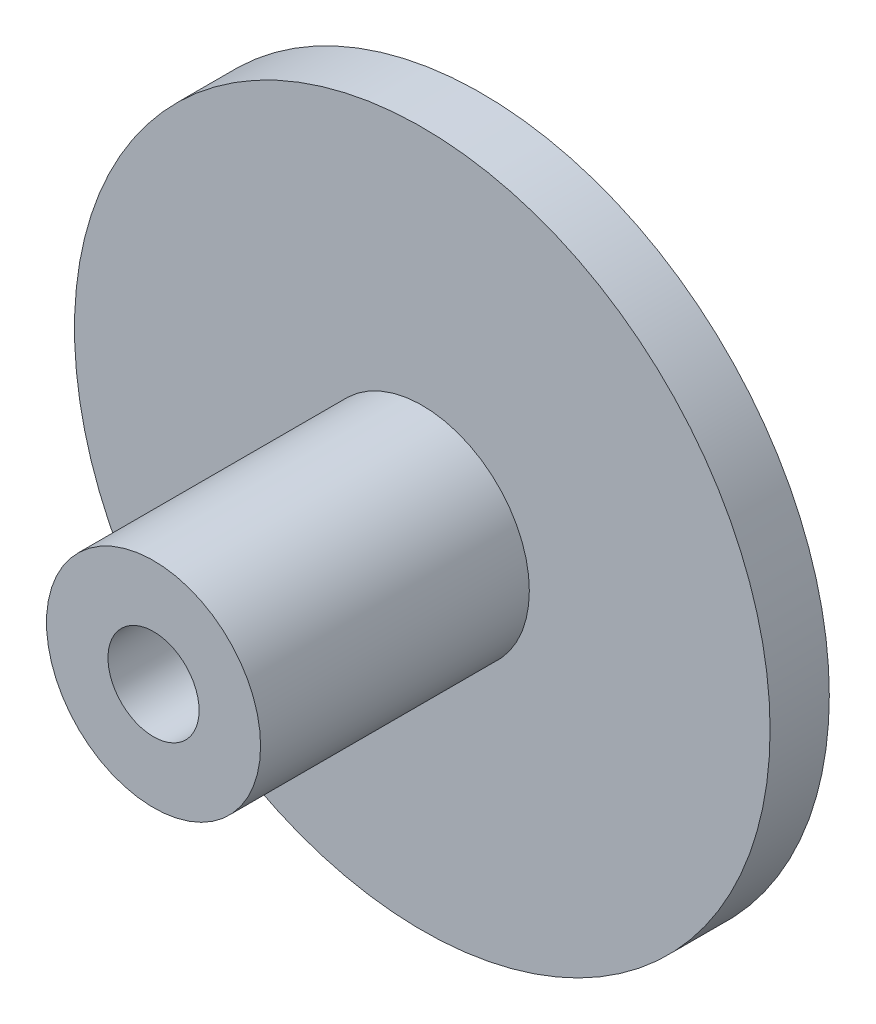
ISO-10303-21;
HEADER;
FILE_DESCRIPTION(('STEP AP214'),'2;1');
FILE_NAME('part.step','',(''),(''),'','','');
FILE_SCHEMA(('AUTOMOTIVE_DESIGN { 1 0 10303 214 1 1 1 1 }'));
ENDSEC;
DATA;
#1=APPLICATION_CONTEXT('core data for automotive mechanical design processes');
#2=APPLICATION_PROTOCOL_DEFINITION('international standard','automotive_design',2000,#1);
#3=PRODUCT_CONTEXT('',#1,'mechanical');
#4=PRODUCT('Part','Part','',(#3));
#5=PRODUCT_RELATED_PRODUCT_CATEGORY('part','',(#4));
#6=PRODUCT_DEFINITION_FORMATION('','',#4);
#7=PRODUCT_DEFINITION_CONTEXT('part definition',#1,'design');
#8=PRODUCT_DEFINITION('design','',#6,#7);
#9=PRODUCT_DEFINITION_SHAPE('','',#8);
#10=(LENGTH_UNIT() NAMED_UNIT(*) SI_UNIT(.MILLI.,.METRE.));
#11=(NAMED_UNIT(*) PLANE_ANGLE_UNIT() SI_UNIT($,.RADIAN.));
#12=(NAMED_UNIT(*) SI_UNIT($,.STERADIAN.) SOLID_ANGLE_UNIT());
#13=UNCERTAINTY_MEASURE_WITH_UNIT(LENGTH_MEASURE(1.E-05),#10,'distance_accuracy_value','');
#14=(GEOMETRIC_REPRESENTATION_CONTEXT(3) GLOBAL_UNCERTAINTY_ASSIGNED_CONTEXT((#13)) GLOBAL_UNIT_ASSIGNED_CONTEXT((#10,
#11,#12)) REPRESENTATION_CONTEXT('',''));
#15=CARTESIAN_POINT('',(0.,0.,0.));
#16=DIRECTION('',(0.,0.,1.));
#17=DIRECTION('',(1.,0.,0.));
#18=AXIS2_PLACEMENT_3D('',#15,#16,#17);
#19=CARTESIAN_POINT('',(0.,0.,1.3));
#20=DIRECTION('',(0.,0.,1.));
#21=DIRECTION('',(1.,0.,0.));
#22=AXIS2_PLACEMENT_3D('',#19,#20,#21);
#23=PLANE('',#22);
#24=CARTESIAN_POINT('',(0.,0.,1.3));
#25=DIRECTION('',(0.,0.,1.));
#26=DIRECTION('',(1.,0.,0.));
#27=AXIS2_PLACEMENT_3D('',#24,#25,#26);
#28=CIRCLE('',#27,7.635);
#29=CARTESIAN_POINT('',(7.635,0.,1.3));
#30=VERTEX_POINT('',#29);
#31=EDGE_CURVE('E10',#30,#30,#28,.T.);
#32=ORIENTED_EDGE('',*,*,#31,.T.);
#33=EDGE_LOOP('',(#32));
#34=FACE_BOUND('',#33,.T.);
#35=CARTESIAN_POINT('',(0.,0.,1.3));
#36=DIRECTION('',(0.,0.,1.));
#37=DIRECTION('',(1.,0.,0.));
#38=AXIS2_PLACEMENT_3D('',#35,#36,#37);
#39=CIRCLE('',#38,2.35);
#40=CARTESIAN_POINT('',(2.35,0.,1.3));
#41=VERTEX_POINT('',#40);
#42=EDGE_CURVE('E57',#41,#41,#39,.T.);
#43=ORIENTED_EDGE('',*,*,#42,.F.);
#44=EDGE_LOOP('',(#43));
#45=FACE_BOUND('',#44,.T.);
#46=ADVANCED_FACE('F41',(#34,#45),#23,.T.);
#47=CARTESIAN_POINT('',(0.,0.,0.));
#48=DIRECTION('',(0.,0.,1.));
#49=DIRECTION('',(1.,0.,0.));
#50=AXIS2_PLACEMENT_3D('',#47,#48,#49);
#51=PLANE('',#50);
#52=CARTESIAN_POINT('',(0.,0.,0.));
#53=DIRECTION('',(0.,0.,1.));
#54=DIRECTION('',(1.,0.,0.));
#55=AXIS2_PLACEMENT_3D('',#52,#53,#54);
#56=CIRCLE('',#55,7.635);
#57=CARTESIAN_POINT('',(7.635,0.,0.));
#58=VERTEX_POINT('',#57);
#59=EDGE_CURVE('E45',#58,#58,#56,.T.);
#60=ORIENTED_EDGE('',*,*,#59,.F.);
#61=EDGE_LOOP('',(#60));
#62=FACE_BOUND('',#61,.T.);
#63=CARTESIAN_POINT('',(0.,0.,0.));
#64=DIRECTION('',(0.,0.,1.));
#65=DIRECTION('',(1.,0.,0.));
#66=AXIS2_PLACEMENT_3D('',#63,#64,#65);
#67=CIRCLE('',#66,1.);
#68=CARTESIAN_POINT('',(1.,0.,0.));
#69=VERTEX_POINT('',#68);
#70=EDGE_CURVE('E52',#69,#69,#67,.T.);
#71=ORIENTED_EDGE('',*,*,#70,.T.);
#72=EDGE_LOOP('',(#71));
#73=FACE_BOUND('',#72,.T.);
#74=ADVANCED_FACE('F82',(#62,#73),#51,.F.);
#75=CARTESIAN_POINT('',(0.,0.,1.3));
#76=DIRECTION('',(0.,0.,-1.));
#77=DIRECTION('',(-1.,0.,0.));
#78=AXIS2_PLACEMENT_3D('',#75,#76,#77);
#79=CYLINDRICAL_SURFACE('',#78,7.635);
#80=ORIENTED_EDGE('',*,*,#31,.F.);
#81=EDGE_LOOP('',(#80));
#82=FACE_BOUND('',#81,.T.);
#83=ORIENTED_EDGE('',*,*,#59,.T.);
#84=EDGE_LOOP('',(#83));
#85=FACE_BOUND('',#84,.T.);
#86=ADVANCED_FACE('F43',(#82,#85),#79,.T.);
#87=CARTESIAN_POINT('',(0.,0.,1.3));
#88=DIRECTION('',(0.,0.,-1.));
#89=DIRECTION('',(-1.,0.,0.));
#90=AXIS2_PLACEMENT_3D('',#87,#88,#89);
#91=CYLINDRICAL_SURFACE('',#90,1.);
#92=ORIENTED_EDGE('',*,*,#70,.F.);
#93=EDGE_LOOP('',(#92));
#94=FACE_BOUND('',#93,.T.);
#95=CARTESIAN_POINT('',(0.,0.,7.2));
#96=DIRECTION('',(0.,0.,1.));
#97=DIRECTION('',(1.,0.,0.));
#98=AXIS2_PLACEMENT_3D('',#95,#96,#97);
#99=CIRCLE('',#98,1.);
#100=CARTESIAN_POINT('',(1.,0.,7.2));
#101=VERTEX_POINT('',#100);
#102=EDGE_CURVE('E60',#101,#101,#99,.T.);
#103=ORIENTED_EDGE('',*,*,#102,.T.);
#104=EDGE_LOOP('',(#103));
#105=FACE_BOUND('',#104,.T.);
#106=ADVANCED_FACE('F66',(#94,#105),#91,.F.);
#107=CARTESIAN_POINT('',(0.,0.,7.2));
#108=DIRECTION('',(0.,0.,1.));
#109=DIRECTION('',(1.,0.,0.));
#110=AXIS2_PLACEMENT_3D('',#107,#108,#109);
#111=PLANE('',#110);
#112=CARTESIAN_POINT('',(0.,0.,7.2));
#113=DIRECTION('',(0.,0.,1.));
#114=DIRECTION('',(1.,0.,0.));
#115=AXIS2_PLACEMENT_3D('',#112,#113,#114);
#116=CIRCLE('',#115,2.35);
#117=CARTESIAN_POINT('',(2.35,0.,7.2));
#118=VERTEX_POINT('',#117);
#119=EDGE_CURVE('E56',#118,#118,#116,.T.);
#120=ORIENTED_EDGE('',*,*,#119,.T.);
#121=EDGE_LOOP('',(#120));
#122=FACE_BOUND('',#121,.T.);
#123=ORIENTED_EDGE('',*,*,#102,.F.);
#124=EDGE_LOOP('',(#123));
#125=FACE_BOUND('',#124,.T.);
#126=ADVANCED_FACE('F68',(#122,#125),#111,.T.);
#127=CARTESIAN_POINT('',(0.,0.,7.2));
#128=DIRECTION('',(0.,0.,-1.));
#129=DIRECTION('',(-1.,0.,0.));
#130=AXIS2_PLACEMENT_3D('',#127,#128,#129);
#131=CYLINDRICAL_SURFACE('',#130,2.35);
#132=ORIENTED_EDGE('',*,*,#119,.F.);
#133=EDGE_LOOP('',(#132));
#134=FACE_BOUND('',#133,.T.);
#135=ORIENTED_EDGE('',*,*,#42,.T.);
#136=EDGE_LOOP('',(#135));
#137=FACE_BOUND('',#136,.T.);
#138=ADVANCED_FACE('F70',(#134,#137),#131,.T.);
#139=CLOSED_SHELL('',(#46,#74,#86,#106,#126,#138));
#140=MANIFOLD_SOLID_BREP('B2',#139);
#141=ADVANCED_BREP_SHAPE_REPRESENTATION('',(#18,#140),#14);
#142=SHAPE_DEFINITION_REPRESENTATION(#9,#141);
ENDSEC;
END-ISO-10303-21;
